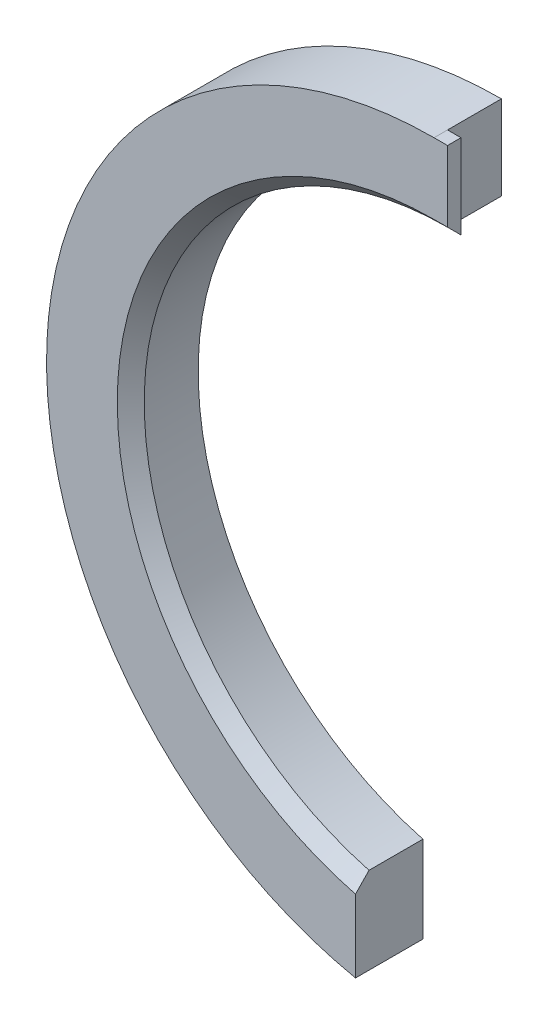
ISO-10303-21;
HEADER;
FILE_DESCRIPTION(('STEP AP214'),'2;1');
FILE_NAME('part.step','',(''),(''),'','','');
FILE_SCHEMA(('AUTOMOTIVE_DESIGN { 1 0 10303 214 1 1 1 1 }'));
ENDSEC;
DATA;
#1=APPLICATION_CONTEXT('core data for automotive mechanical design processes');
#2=APPLICATION_PROTOCOL_DEFINITION('international standard','automotive_design',2000,#1);
#3=PRODUCT_CONTEXT('',#1,'mechanical');
#4=PRODUCT('Part','Part','',(#3));
#5=PRODUCT_RELATED_PRODUCT_CATEGORY('part','',(#4));
#6=PRODUCT_DEFINITION_FORMATION('','',#4);
#7=PRODUCT_DEFINITION_CONTEXT('part definition',#1,'design');
#8=PRODUCT_DEFINITION('design','',#6,#7);
#9=PRODUCT_DEFINITION_SHAPE('','',#8);
#10=(LENGTH_UNIT() NAMED_UNIT(*) SI_UNIT(.MILLI.,.METRE.));
#11=(NAMED_UNIT(*) PLANE_ANGLE_UNIT() SI_UNIT($,.RADIAN.));
#12=(NAMED_UNIT(*) SI_UNIT($,.STERADIAN.) SOLID_ANGLE_UNIT());
#13=UNCERTAINTY_MEASURE_WITH_UNIT(LENGTH_MEASURE(1.E-05),#10,'distance_accuracy_value','');
#14=(GEOMETRIC_REPRESENTATION_CONTEXT(3) GLOBAL_UNCERTAINTY_ASSIGNED_CONTEXT((#13)) GLOBAL_UNIT_ASSIGNED_CONTEXT((#10,
#11,#12)) REPRESENTATION_CONTEXT('',''));
#15=CARTESIAN_POINT('',(0.,0.,0.));
#16=DIRECTION('',(0.,0.,1.));
#17=DIRECTION('',(1.,0.,0.));
#18=AXIS2_PLACEMENT_3D('',#15,#16,#17);
#19=CARTESIAN_POINT('',(0.,0.,10.));
#20=DIRECTION('',(0.,0.,1.));
#21=DIRECTION('',(1.,0.,0.));
#22=AXIS2_PLACEMENT_3D('',#19,#20,#21);
#23=CONICAL_SURFACE('',#22,47.,0.785398163397447);
#24=CARTESIAN_POINT('',(0.,0.,8.));
#25=DIRECTION('',(0.,0.,1.));
#26=DIRECTION('',(1.,0.,0.));
#27=AXIS2_PLACEMENT_3D('',#24,#25,#26);
#28=CIRCLE('',#27,45.);
#29=CARTESIAN_POINT('',(0.,45.,8.));
#30=VERTEX_POINT('',#29);
#31=CARTESIAN_POINT('',(-11.6505113733433,-43.4656828399095,8.));
#32=VERTEX_POINT('',#31);
#33=EDGE_CURVE('E69',#30,#32,#28,.T.);
#34=ORIENTED_EDGE('',*,*,#33,.F.);
#35=DIRECTION('',(0.,0.707106781186547,0.707106781186548));
#36=VECTOR('',#35,1.);
#37=CARTESIAN_POINT('',(0.,0.,-37.0000000000001));
#38=LINE('',#37,#36);
#39=CARTESIAN_POINT('',(0.,47.,10.));
#40=VERTEX_POINT('',#39);
#41=EDGE_CURVE('E149',#30,#40,#38,.T.);
#42=ORIENTED_EDGE('',*,*,#41,.T.);
#43=CARTESIAN_POINT('',(0.,0.,10.));
#44=DIRECTION('',(0.,0.,1.));
#45=DIRECTION('',(1.,0.,0.));
#46=AXIS2_PLACEMENT_3D('',#43,#44,#45);
#47=CIRCLE('',#46,47.);
#48=CARTESIAN_POINT('',(-11.6505113733433,-45.5331262350786,10.));
#49=VERTEX_POINT('',#48);
#50=EDGE_CURVE('E168',#49,#40,#47,.F.);
#51=ORIENTED_EDGE('',*,*,#50,.F.);
#52=CARTESIAN_POINT('',(-11.6505113733433,-43.4656828399095,8.));
#53=CARTESIAN_POINT('',(-11.6505113733433,-44.4412381508422,8.94232039661794));
#54=CARTESIAN_POINT('',(-11.6505113733433,-45.4157583045465,9.88571114060221));
#55=CARTESIAN_POINT('',(-11.6505113733433,-47.3630266105597,11.7743149482943));
#56=CARTESIAN_POINT('',(-11.6505113733433,-48.3357747673376,12.719528007394));
#57=CARTESIAN_POINT('',(-11.6505113733433,-50.2798015606856,14.6114620970632));
#58=CARTESIAN_POINT('',(-11.6505113733433,-51.2510801983983,15.558183126459));
#59=CARTESIAN_POINT('',(-11.6505113733433,-53.192384306678,17.4529141431277));
#60=CARTESIAN_POINT('',(-11.6505113733433,-54.162409774083,18.4009241336403));
#61=CARTESIAN_POINT('',(-11.6505113733433,-55.1319140085283,19.3494663462234));
#62=B_SPLINE_CURVE_WITH_KNOTS('',3,(#52,#53,#54,#55,#56,#57,#58,#59,#60,#61),.UNSPECIFIED.,.F.,
.F.,(4,2,2,2,4),(0.,4.06903744118193,8.13806460644451,12.2070886062924,16.276122852952),.UNSPECIFIED.);
#63=EDGE_CURVE('E54',#32,#49,#62,.T.);
#64=ORIENTED_EDGE('',*,*,#63,.F.);
#65=EDGE_LOOP('',(#34,#42,#51,#64));
#66=FACE_BOUND('',#65,.T.);
#67=ADVANCED_FACE('F46',(#66),#23,.F.);
#68=CARTESIAN_POINT('',(0.,0.,10.));
#69=DIRECTION('',(0.,0.,-1.));
#70=DIRECTION('',(-1.,0.,0.));
#71=AXIS2_PLACEMENT_3D('',#68,#69,#70);
#72=CYLINDRICAL_SURFACE('',#71,57.5);
#73=DIRECTION('',(0.,0.,-1.));
#74=VECTOR('',#73,1.);
#75=CARTESIAN_POINT('',(0.,57.5,10.));
#76=LINE('',#75,#74);
#77=CARTESIAN_POINT('',(0.,57.5,0.));
#78=VERTEX_POINT('',#77);
#79=CARTESIAN_POINT('',(0.,57.5,8.));
#80=VERTEX_POINT('',#79);
#81=EDGE_CURVE('E150',#78,#80,#76,.F.);
#82=ORIENTED_EDGE('',*,*,#81,.F.);
#83=CARTESIAN_POINT('',(0.,0.,0.));
#84=DIRECTION('',(0.,0.,1.));
#85=DIRECTION('',(1.,0.,0.));
#86=AXIS2_PLACEMENT_3D('',#83,#84,#85);
#87=CIRCLE('',#86,57.5);
#88=CARTESIAN_POINT('',(-11.6505113733433,-56.3073315363071,0.));
#89=VERTEX_POINT('',#88);
#90=EDGE_CURVE('E161',#78,#89,#87,.T.);
#91=ORIENTED_EDGE('',*,*,#90,.T.);
#92=DIRECTION('',(0.,0.,-1.));
#93=VECTOR('',#92,1.);
#94=CARTESIAN_POINT('',(-11.6505113733433,-56.3073315363071,10.));
#95=LINE('',#94,#93);
#96=CARTESIAN_POINT('',(-11.6505113733433,-56.3073315363071,10.));
#97=VERTEX_POINT('',#96);
#98=EDGE_CURVE('E156',#89,#97,#95,.F.);
#99=ORIENTED_EDGE('',*,*,#98,.T.);
#100=CARTESIAN_POINT('',(0.,0.,10.));
#101=DIRECTION('',(0.,0.,1.));
#102=DIRECTION('',(1.,0.,0.));
#103=AXIS2_PLACEMENT_3D('',#100,#101,#102);
#104=CIRCLE('',#103,57.5);
#105=CARTESIAN_POINT('',(0.,57.5,10.));
#106=VERTEX_POINT('',#105);
#107=EDGE_CURVE('E165',#106,#97,#104,.T.);
#108=ORIENTED_EDGE('',*,*,#107,.F.);
#109=DIRECTION('',(0.,0.,1.));
#110=VECTOR('',#109,1.);
#111=CARTESIAN_POINT('',(0.,57.5,10.));
#112=LINE('',#111,#110);
#113=EDGE_CURVE('E128',#80,#106,#112,.T.);
#114=ORIENTED_EDGE('',*,*,#113,.F.);
#115=EDGE_LOOP('',(#82,#91,#99,#108,#114));
#116=FACE_BOUND('',#115,.T.);
#117=ADVANCED_FACE('F189',(#116),#72,.T.);
#118=CARTESIAN_POINT('',(0.,0.,10.));
#119=DIRECTION('',(0.,0.,-1.));
#120=DIRECTION('',(-1.,0.,0.));
#121=AXIS2_PLACEMENT_3D('',#118,#119,#120);
#122=CYLINDRICAL_SURFACE('',#121,45.);
#123=CARTESIAN_POINT('',(0.,0.,0.));
#124=DIRECTION('',(0.,0.,1.));
#125=DIRECTION('',(1.,0.,0.));
#126=AXIS2_PLACEMENT_3D('',#123,#124,#125);
#127=CIRCLE('',#126,45.);
#128=CARTESIAN_POINT('',(0.,45.,0.));
#129=VERTEX_POINT('',#128);
#130=CARTESIAN_POINT('',(-11.6505113733433,-43.4656828399095,0.));
#131=VERTEX_POINT('',#130);
#132=EDGE_CURVE('E163',#129,#131,#127,.T.);
#133=ORIENTED_EDGE('',*,*,#132,.F.);
#134=DIRECTION('',(0.,0.,-1.));
#135=VECTOR('',#134,1.);
#136=CARTESIAN_POINT('',(0.,45.,10.));
#137=LINE('',#136,#135);
#138=EDGE_CURVE('E13',#129,#30,#137,.F.);
#139=ORIENTED_EDGE('',*,*,#138,.T.);
#140=ORIENTED_EDGE('',*,*,#33,.T.);
#141=DIRECTION('',(0.,0.,-1.));
#142=VECTOR('',#141,1.);
#143=CARTESIAN_POINT('',(-11.6505113733433,-43.4656828399095,10.));
#144=LINE('',#143,#142);
#145=EDGE_CURVE('E151',#32,#131,#144,.T.);
#146=ORIENTED_EDGE('',*,*,#145,.T.);
#147=EDGE_LOOP('',(#133,#139,#140,#146));
#148=FACE_BOUND('',#147,.T.);
#149=ADVANCED_FACE('F183',(#148),#122,.F.);
#150=CARTESIAN_POINT('',(0.,0.,10.));
#151=DIRECTION('',(0.,0.,1.));
#152=DIRECTION('',(1.,0.,0.));
#153=AXIS2_PLACEMENT_3D('',#150,#151,#152);
#154=PLANE('',#153);
#155=ORIENTED_EDGE('',*,*,#50,.T.);
#156=DIRECTION('',(-1.,0.,0.));
#157=VECTOR('',#156,1.);
#158=CARTESIAN_POINT('',(2.,47.,10.));
#159=LINE('',#158,#157);
#160=CARTESIAN_POINT('',(2.,47.,10.));
#161=VERTEX_POINT('',#160);
#162=EDGE_CURVE('E140',#161,#40,#159,.T.);
#163=ORIENTED_EDGE('',*,*,#162,.F.);
#164=DIRECTION('',(0.,-1.,0.));
#165=VECTOR('',#164,1.);
#166=CARTESIAN_POINT('',(2.,47.,10.));
#167=LINE('',#166,#165);
#168=CARTESIAN_POINT('',(2.,57.5,10.));
#169=VERTEX_POINT('',#168);
#170=EDGE_CURVE('E118',#169,#161,#167,.T.);
#171=ORIENTED_EDGE('',*,*,#170,.F.);
#172=DIRECTION('',(-1.,0.,0.));
#173=VECTOR('',#172,1.);
#174=CARTESIAN_POINT('',(2.,57.5,10.));
#175=LINE('',#174,#173);
#176=EDGE_CURVE('E116',#169,#106,#175,.T.);
#177=ORIENTED_EDGE('',*,*,#176,.T.);
#178=ORIENTED_EDGE('',*,*,#107,.T.);
#179=DIRECTION('',(0.,1.,0.));
#180=VECTOR('',#179,1.);
#181=CARTESIAN_POINT('',(-11.6505113733433,-43.4656828399095,10.));
#182=LINE('',#181,#180);
#183=EDGE_CURVE('E152',#97,#49,#182,.T.);
#184=ORIENTED_EDGE('',*,*,#183,.T.);
#185=EDGE_LOOP('',(#155,#163,#171,#177,#178,#184));
#186=FACE_BOUND('',#185,.T.);
#187=ADVANCED_FACE('F190',(#186),#154,.T.);
#188=CARTESIAN_POINT('',(0.,0.,0.));
#189=DIRECTION('',(0.,0.,1.));
#190=DIRECTION('',(1.,0.,0.));
#191=AXIS2_PLACEMENT_3D('',#188,#189,#190);
#192=PLANE('',#191);
#193=ORIENTED_EDGE('',*,*,#90,.F.);
#194=DIRECTION('',(0.,-1.,0.));
#195=VECTOR('',#194,1.);
#196=CARTESIAN_POINT('',(0.,-57.4149414171385,0.));
#197=LINE('',#196,#195);
#198=EDGE_CURVE('E145',#78,#129,#197,.T.);
#199=ORIENTED_EDGE('',*,*,#198,.T.);
#200=ORIENTED_EDGE('',*,*,#132,.T.);
#201=DIRECTION('',(0.,1.,0.));
#202=VECTOR('',#201,1.);
#203=CARTESIAN_POINT('',(-11.6505113733433,-43.4656828399095,0.));
#204=LINE('',#203,#202);
#205=EDGE_CURVE('E147',#89,#131,#204,.T.);
#206=ORIENTED_EDGE('',*,*,#205,.F.);
#207=EDGE_LOOP('',(#193,#199,#200,#206));
#208=FACE_BOUND('',#207,.T.);
#209=ADVANCED_FACE('F181',(#208),#192,.F.);
#210=CARTESIAN_POINT('',(-11.6505113733433,-43.4656828399095,10.));
#211=DIRECTION('',(-1.,0.,0.));
#212=DIRECTION('',(0.,-1.,0.));
#213=AXIS2_PLACEMENT_3D('',#210,#211,#212);
#214=PLANE('',#213);
#215=ORIENTED_EDGE('',*,*,#145,.F.);
#216=ORIENTED_EDGE('',*,*,#63,.T.);
#217=ORIENTED_EDGE('',*,*,#183,.F.);
#218=ORIENTED_EDGE('',*,*,#98,.F.);
#219=ORIENTED_EDGE('',*,*,#205,.T.);
#220=EDGE_LOOP('',(#215,#216,#217,#218,#219));
#221=FACE_BOUND('',#220,.T.);
#222=ADVANCED_FACE('F174',(#221),#214,.F.);
#223=CARTESIAN_POINT('',(0.,-57.4149414171385,10.));
#224=DIRECTION('',(1.,0.,0.));
#225=DIRECTION('',(0.,0.,-1.));
#226=AXIS2_PLACEMENT_3D('',#223,#224,#225);
#227=PLANE('',#226);
#228=DIRECTION('',(0.,1.,0.));
#229=VECTOR('',#228,1.);
#230=CARTESIAN_POINT('',(0.,57.5,8.));
#231=LINE('',#230,#229);
#232=EDGE_CURVE('E61',#30,#80,#231,.T.);
#233=ORIENTED_EDGE('',*,*,#232,.F.);
#234=ORIENTED_EDGE('',*,*,#138,.F.);
#235=ORIENTED_EDGE('',*,*,#198,.F.);
#236=ORIENTED_EDGE('',*,*,#81,.T.);
#237=EDGE_LOOP('',(#233,#234,#235,#236));
#238=FACE_BOUND('',#237,.T.);
#239=ADVANCED_FACE('F179',(#238),#227,.T.);
#240=CARTESIAN_POINT('',(2.,57.5,8.));
#241=DIRECTION('',(0.,0.,1.));
#242=DIRECTION('',(1.,0.,0.));
#243=AXIS2_PLACEMENT_3D('',#240,#241,#242);
#244=PLANE('',#243);
#245=ORIENTED_EDGE('',*,*,#232,.T.);
#246=DIRECTION('',(-1.,0.,0.));
#247=VECTOR('',#246,1.);
#248=CARTESIAN_POINT('',(2.,57.5,8.));
#249=LINE('',#248,#247);
#250=CARTESIAN_POINT('',(2.,57.5,8.));
#251=VERTEX_POINT('',#250);
#252=EDGE_CURVE('E112',#251,#80,#249,.T.);
#253=ORIENTED_EDGE('',*,*,#252,.F.);
#254=DIRECTION('',(0.,1.,0.));
#255=VECTOR('',#254,1.);
#256=CARTESIAN_POINT('',(2.,57.5,8.));
#257=LINE('',#256,#255);
#258=CARTESIAN_POINT('',(2.,45.,8.));
#259=VERTEX_POINT('',#258);
#260=EDGE_CURVE('E119',#259,#251,#257,.T.);
#261=ORIENTED_EDGE('',*,*,#260,.F.);
#262=DIRECTION('',(-1.,0.,0.));
#263=VECTOR('',#262,1.);
#264=CARTESIAN_POINT('',(2.,45.,8.));
#265=LINE('',#264,#263);
#266=EDGE_CURVE('E211',#259,#30,#265,.T.);
#267=ORIENTED_EDGE('',*,*,#266,.T.);
#268=EDGE_LOOP('',(#245,#253,#261,#267));
#269=FACE_BOUND('',#268,.T.);
#270=ADVANCED_FACE('F132',(#269),#244,.F.);
#271=CARTESIAN_POINT('',(2.,57.5,10.));
#272=DIRECTION('',(0.,-1.,0.));
#273=DIRECTION('',(0.,0.,-1.));
#274=AXIS2_PLACEMENT_3D('',#271,#272,#273);
#275=PLANE('',#274);
#276=ORIENTED_EDGE('',*,*,#113,.T.);
#277=ORIENTED_EDGE('',*,*,#176,.F.);
#278=DIRECTION('',(0.,0.,1.));
#279=VECTOR('',#278,1.);
#280=CARTESIAN_POINT('',(2.,57.5,10.));
#281=LINE('',#280,#279);
#282=EDGE_CURVE('E107',#251,#169,#281,.T.);
#283=ORIENTED_EDGE('',*,*,#282,.F.);
#284=ORIENTED_EDGE('',*,*,#252,.T.);
#285=EDGE_LOOP('',(#276,#277,#283,#284));
#286=FACE_BOUND('',#285,.T.);
#287=ADVANCED_FACE('F115',(#286),#275,.F.);
#288=CARTESIAN_POINT('',(2.,45.,8.));
#289=DIRECTION('',(0.,0.707106781186548,-0.707106781186547));
#290=DIRECTION('',(0.,0.707106781186547,0.707106781186548));
#291=AXIS2_PLACEMENT_3D('',#288,#289,#290);
#292=PLANE('',#291);
#293=ORIENTED_EDGE('',*,*,#41,.F.);
#294=ORIENTED_EDGE('',*,*,#266,.F.);
#295=DIRECTION('',(0.,-0.707106781186547,-0.707106781186548));
#296=VECTOR('',#295,1.);
#297=CARTESIAN_POINT('',(2.,45.,8.));
#298=LINE('',#297,#296);
#299=EDGE_CURVE('E123',#161,#259,#298,.T.);
#300=ORIENTED_EDGE('',*,*,#299,.F.);
#301=ORIENTED_EDGE('',*,*,#162,.T.);
#302=EDGE_LOOP('',(#293,#294,#300,#301));
#303=FACE_BOUND('',#302,.T.);
#304=ADVANCED_FACE('F219',(#303),#292,.F.);
#305=CARTESIAN_POINT('',(2.,0.,0.));
#306=DIRECTION('',(1.,0.,0.));
#307=DIRECTION('',(0.,0.,-1.));
#308=AXIS2_PLACEMENT_3D('',#305,#306,#307);
#309=PLANE('',#308);
#310=ORIENTED_EDGE('',*,*,#260,.T.);
#311=ORIENTED_EDGE('',*,*,#282,.T.);
#312=ORIENTED_EDGE('',*,*,#170,.T.);
#313=ORIENTED_EDGE('',*,*,#299,.T.);
#314=EDGE_LOOP('',(#310,#311,#312,#313));
#315=FACE_BOUND('',#314,.T.);
#316=ADVANCED_FACE('F124',(#315),#309,.T.);
#317=CLOSED_SHELL('',(#67,#117,#149,#187,#209,#222,#239,#270,#287,#304,#316));
#318=CARTESIAN_POINT('',(-6.,51.25,5.));
#319=DIRECTION('',(0.,0.,-1.));
#320=DIRECTION('',(-1.,0.,0.));
#321=AXIS2_PLACEMENT_3D('',#318,#319,#320);
#322=CYLINDRICAL_SURFACE('',#321,4.);
#323=CARTESIAN_POINT('',(-6.,51.25,5.));
#324=DIRECTION('',(0.,0.,-1.));
#325=DIRECTION('',(-1.,0.,0.));
#326=AXIS2_PLACEMENT_3D('',#323,#324,#325);
#327=CIRCLE('',#326,4.);
#328=CARTESIAN_POINT('',(-10.,51.25,5.));
#329=VERTEX_POINT('',#328);
#330=EDGE_CURVE('E133',#329,#329,#327,.T.);
#331=ORIENTED_EDGE('',*,*,#330,.F.);
#332=EDGE_LOOP('',(#331));
#333=FACE_BOUND('',#332,.T.);
#334=CARTESIAN_POINT('',(-6.,51.25,2.));
#335=DIRECTION('',(0.,0.,-1.));
#336=DIRECTION('',(-1.,0.,0.));
#337=AXIS2_PLACEMENT_3D('',#334,#335,#336);
#338=CIRCLE('',#337,4.);
#339=CARTESIAN_POINT('',(-10.,51.25,2.));
#340=VERTEX_POINT('',#339);
#341=EDGE_CURVE('E135',#340,#340,#338,.T.);
#342=ORIENTED_EDGE('',*,*,#341,.T.);
#343=EDGE_LOOP('',(#342));
#344=FACE_BOUND('',#343,.T.);
#345=ADVANCED_FACE('F232',(#333,#344),#322,.F.);
#346=CARTESIAN_POINT('',(-6.,51.25,5.));
#347=DIRECTION('',(0.,0.,-1.));
#348=DIRECTION('',(-1.,0.,0.));
#349=AXIS2_PLACEMENT_3D('',#346,#347,#348);
#350=PLANE('',#349);
#351=ORIENTED_EDGE('',*,*,#330,.T.);
#352=EDGE_LOOP('',(#351));
#353=FACE_BOUND('',#352,.T.);
#354=ADVANCED_FACE('F233',(#353),#350,.T.);
#355=CARTESIAN_POINT('',(-6.,51.25,2.));
#356=DIRECTION('',(0.,0.,-1.));
#357=DIRECTION('',(-1.,0.,0.));
#358=AXIS2_PLACEMENT_3D('',#355,#356,#357);
#359=PLANE('',#358);
#360=ORIENTED_EDGE('',*,*,#341,.F.);
#361=EDGE_LOOP('',(#360));
#362=FACE_BOUND('',#361,.T.);
#363=ADVANCED_FACE('F234',(#362),#359,.F.);
#364=CLOSED_SHELL('',(#345,#354,#363));
#365=ORIENTED_CLOSED_SHELL('',*,#364,.T.);
#366=BREP_WITH_VOIDS('B2',#317,(#365));
#367=ADVANCED_BREP_SHAPE_REPRESENTATION('',(#18,#366),#14);
#368=SHAPE_DEFINITION_REPRESENTATION(#9,#367);
ENDSEC;
END-ISO-10303-21;
